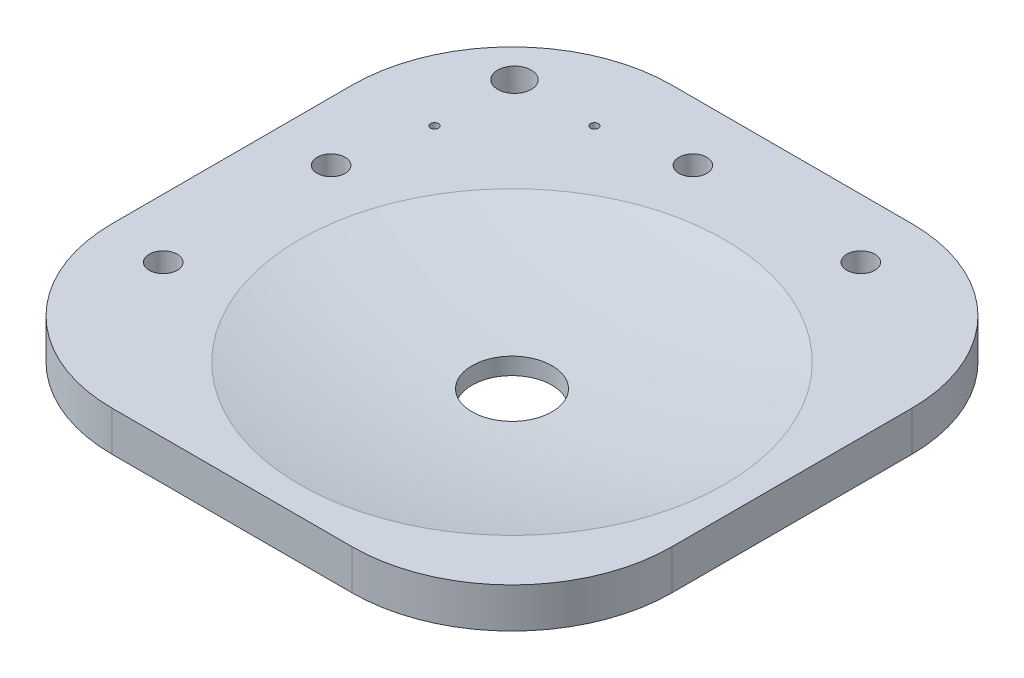
ISO-10303-21;
HEADER;
FILE_DESCRIPTION(('STEP AP214'),'2;1');
FILE_NAME('part.step','',(''),(''),'','','');
FILE_SCHEMA(('AUTOMOTIVE_DESIGN { 1 0 10303 214 1 1 1 1 }'));
ENDSEC;
DATA;
#1=APPLICATION_CONTEXT('core data for automotive mechanical design processes');
#2=APPLICATION_PROTOCOL_DEFINITION('international standard','automotive_design',2000,#1);
#3=PRODUCT_CONTEXT('',#1,'mechanical');
#4=PRODUCT('Part','Part','',(#3));
#5=PRODUCT_RELATED_PRODUCT_CATEGORY('part','',(#4));
#6=PRODUCT_DEFINITION_FORMATION('','',#4);
#7=PRODUCT_DEFINITION_CONTEXT('part definition',#1,'design');
#8=PRODUCT_DEFINITION('design','',#6,#7);
#9=PRODUCT_DEFINITION_SHAPE('','',#8);
#10=(LENGTH_UNIT() NAMED_UNIT(*) SI_UNIT(.MILLI.,.METRE.));
#11=(NAMED_UNIT(*) PLANE_ANGLE_UNIT() SI_UNIT($,.RADIAN.));
#12=(NAMED_UNIT(*) SI_UNIT($,.STERADIAN.) SOLID_ANGLE_UNIT());
#13=UNCERTAINTY_MEASURE_WITH_UNIT(LENGTH_MEASURE(1.E-05),#10,'distance_accuracy_value','');
#14=(GEOMETRIC_REPRESENTATION_CONTEXT(3) GLOBAL_UNCERTAINTY_ASSIGNED_CONTEXT((#13)) GLOBAL_UNIT_ASSIGNED_CONTEXT((#10,
#11,#12)) REPRESENTATION_CONTEXT('',''));
#15=CARTESIAN_POINT('',(0.,0.,0.));
#16=DIRECTION('',(0.,0.,1.));
#17=DIRECTION('',(1.,0.,0.));
#18=AXIS2_PLACEMENT_3D('',#15,#16,#17);
#19=CARTESIAN_POINT('',(30.,5.,30.));
#20=DIRECTION('',(-1.,0.,0.));
#21=DIRECTION('',(0.,0.,1.));
#22=AXIS2_PLACEMENT_3D('',#19,#20,#21);
#23=PLANE('',#22);
#24=DIRECTION('',(0.,0.,-1.));
#25=VECTOR('',#24,1.);
#26=CARTESIAN_POINT('',(30.,0.,30.));
#27=LINE('',#26,#25);
#28=CARTESIAN_POINT('',(30.,0.,10.));
#29=VERTEX_POINT('',#28);
#30=CARTESIAN_POINT('',(30.,0.,-20.));
#31=VERTEX_POINT('',#30);
#32=EDGE_CURVE('E147',#29,#31,#27,.T.);
#33=ORIENTED_EDGE('',*,*,#32,.T.);
#34=DIRECTION('',(0.,-1.,0.));
#35=VECTOR('',#34,1.);
#36=CARTESIAN_POINT('',(30.,5.,-20.));
#37=LINE('',#36,#35);
#38=CARTESIAN_POINT('',(30.,5.,-20.));
#39=VERTEX_POINT('',#38);
#40=EDGE_CURVE('E106',#31,#39,#37,.F.);
#41=ORIENTED_EDGE('',*,*,#40,.T.);
#42=DIRECTION('',(0.,0.,-1.));
#43=VECTOR('',#42,1.);
#44=CARTESIAN_POINT('',(30.,5.,30.));
#45=LINE('',#44,#43);
#46=CARTESIAN_POINT('',(30.,5.,10.));
#47=VERTEX_POINT('',#46);
#48=EDGE_CURVE('E148',#47,#39,#45,.T.);
#49=ORIENTED_EDGE('',*,*,#48,.F.);
#50=DIRECTION('',(0.,-1.,0.));
#51=VECTOR('',#50,1.);
#52=CARTESIAN_POINT('',(30.,5.,10.));
#53=LINE('',#52,#51);
#54=EDGE_CURVE('E111',#47,#29,#53,.T.);
#55=ORIENTED_EDGE('',*,*,#54,.T.);
#56=EDGE_LOOP('',(#33,#41,#49,#55));
#57=FACE_BOUND('',#56,.T.);
#58=ADVANCED_FACE('F33',(#57),#23,.F.);
#59=CARTESIAN_POINT('',(-30.,5.,30.));
#60=DIRECTION('',(0.,0.,-1.));
#61=DIRECTION('',(-1.,0.,0.));
#62=AXIS2_PLACEMENT_3D('',#59,#60,#61);
#63=PLANE('',#62);
#64=DIRECTION('',(1.,0.,0.));
#65=VECTOR('',#64,1.);
#66=CARTESIAN_POINT('',(-30.,5.,30.));
#67=LINE('',#66,#65);
#68=CARTESIAN_POINT('',(-20.,5.,30.));
#69=VERTEX_POINT('',#68);
#70=CARTESIAN_POINT('',(10.,5.,30.));
#71=VERTEX_POINT('',#70);
#72=EDGE_CURVE('E151',#69,#71,#67,.T.);
#73=ORIENTED_EDGE('',*,*,#72,.F.);
#74=DIRECTION('',(0.,-1.,0.));
#75=VECTOR('',#74,1.);
#76=CARTESIAN_POINT('',(-20.,5.,30.));
#77=LINE('',#76,#75);
#78=CARTESIAN_POINT('',(-20.,0.,30.));
#79=VERTEX_POINT('',#78);
#80=EDGE_CURVE('E11',#69,#79,#77,.T.);
#81=ORIENTED_EDGE('',*,*,#80,.T.);
#82=DIRECTION('',(1.,0.,0.));
#83=VECTOR('',#82,1.);
#84=CARTESIAN_POINT('',(-30.,0.,30.));
#85=LINE('',#84,#83);
#86=CARTESIAN_POINT('',(10.,0.,30.));
#87=VERTEX_POINT('',#86);
#88=EDGE_CURVE('E152',#79,#87,#85,.T.);
#89=ORIENTED_EDGE('',*,*,#88,.T.);
#90=DIRECTION('',(0.,-1.,0.));
#91=VECTOR('',#90,1.);
#92=CARTESIAN_POINT('',(10.,5.,30.));
#93=LINE('',#92,#91);
#94=EDGE_CURVE('E42',#87,#71,#93,.F.);
#95=ORIENTED_EDGE('',*,*,#94,.T.);
#96=EDGE_LOOP('',(#73,#81,#89,#95));
#97=FACE_BOUND('',#96,.T.);
#98=ADVANCED_FACE('F213',(#97),#63,.F.);
#99=CARTESIAN_POINT('',(0.,5.,0.));
#100=DIRECTION('',(0.,-1.,0.));
#101=DIRECTION('',(0.,0.,-1.));
#102=AXIS2_PLACEMENT_3D('',#99,#100,#101);
#103=PLANE('',#102);
#104=CARTESIAN_POINT('',(-30.4282430407,5.,-20.7373748181108));
#105=DIRECTION('',(0.,1.,0.));
#106=DIRECTION('',(0.,0.,1.));
#107=AXIS2_PLACEMENT_3D('',#104,#105,#106);
#108=CIRCLE('',#107,0.499999999999999);
#109=CARTESIAN_POINT('',(-30.4282430407,5.,-20.2373748181108));
#110=VERTEX_POINT('',#109);
#111=EDGE_CURVE('E319',#110,#110,#108,.T.);
#112=ORIENTED_EDGE('',*,*,#111,.F.);
#113=EDGE_LOOP('',(#112));
#114=FACE_BOUND('',#113,.T.);
#115=CARTESIAN_POINT('',(-20.4282430407,5.,-30.7373748181108));
#116=DIRECTION('',(0.,1.,0.));
#117=DIRECTION('',(0.,0.,1.));
#118=AXIS2_PLACEMENT_3D('',#115,#116,#117);
#119=CIRCLE('',#118,0.499999999999999);
#120=CARTESIAN_POINT('',(-20.4282430407,5.,-30.2373748181108));
#121=VERTEX_POINT('',#120);
#122=EDGE_CURVE('E318',#121,#121,#119,.T.);
#123=ORIENTED_EDGE('',*,*,#122,.F.);
#124=EDGE_LOOP('',(#123));
#125=FACE_BOUND('',#124,.T.);
#126=CARTESIAN_POINT('',(-30.4282430407,5.,-30.7373748181108));
#127=DIRECTION('',(0.,1.,0.));
#128=DIRECTION('',(0.,0.,1.));
#129=AXIS2_PLACEMENT_3D('',#126,#127,#128);
#130=CIRCLE('',#129,2.1);
#131=CARTESIAN_POINT('',(-30.4282430407,5.,-28.6373748181108));
#132=VERTEX_POINT('',#131);
#133=EDGE_CURVE('E182',#132,#132,#130,.T.);
#134=ORIENTED_EDGE('',*,*,#133,.F.);
#135=EDGE_LOOP('',(#134));
#136=FACE_BOUND('',#135,.T.);
#137=CARTESIAN_POINT('',(-32.6274169979694,5.,11.));
#138=DIRECTION('',(0.,1.,0.));
#139=DIRECTION('',(0.,0.,1.));
#140=AXIS2_PLACEMENT_3D('',#137,#138,#139);
#141=CIRCLE('',#140,1.75000000000008);
#142=CARTESIAN_POINT('',(-32.6274169979694,5.,12.7500000000001));
#143=VERTEX_POINT('',#142);
#144=EDGE_CURVE('E187',#143,#143,#141,.T.);
#145=ORIENTED_EDGE('',*,*,#144,.F.);
#146=EDGE_LOOP('',(#145));
#147=FACE_BOUND('',#146,.T.);
#148=CARTESIAN_POINT('',(11.,5.,-32.6274169979696));
#149=DIRECTION('',(0.,1.,0.));
#150=DIRECTION('',(0.,0.,1.));
#151=AXIS2_PLACEMENT_3D('',#148,#149,#150);
#152=CIRCLE('',#151,1.75000000000003);
#153=CARTESIAN_POINT('',(11.,5.,-30.8774169979696));
#154=VERTEX_POINT('',#153);
#155=EDGE_CURVE('E196',#154,#154,#152,.T.);
#156=ORIENTED_EDGE('',*,*,#155,.F.);
#157=EDGE_LOOP('',(#156));
#158=FACE_BOUND('',#157,.T.);
#159=CARTESIAN_POINT('',(-10.,5.,-32.6274169979696));
#160=DIRECTION('',(0.,1.,0.));
#161=DIRECTION('',(0.,0.,1.));
#162=AXIS2_PLACEMENT_3D('',#159,#160,#161);
#163=CIRCLE('',#162,1.75);
#164=CARTESIAN_POINT('',(-10.,5.,-30.8774169979696));
#165=VERTEX_POINT('',#164);
#166=EDGE_CURVE('E303',#165,#165,#163,.T.);
#167=ORIENTED_EDGE('',*,*,#166,.F.);
#168=EDGE_LOOP('',(#167));
#169=FACE_BOUND('',#168,.T.);
#170=CARTESIAN_POINT('',(-32.6274169979694,5.,-9.99999999999999));
#171=DIRECTION('',(0.,1.,0.));
#172=DIRECTION('',(0.,0.,1.));
#173=AXIS2_PLACEMENT_3D('',#170,#171,#172);
#174=CIRCLE('',#173,1.75);
#175=CARTESIAN_POINT('',(-32.6274169979694,5.,-8.24999999999999));
#176=VERTEX_POINT('',#175);
#177=EDGE_CURVE('E134',#176,#176,#174,.T.);
#178=ORIENTED_EDGE('',*,*,#177,.F.);
#179=EDGE_LOOP('',(#178));
#180=FACE_BOUND('',#179,.T.);
#181=ORIENTED_EDGE('',*,*,#48,.T.);
#182=CARTESIAN_POINT('',(10.,5.,-20.));
#183=DIRECTION('',(0.,-1.,0.));
#184=DIRECTION('',(0.,0.,-1.));
#185=AXIS2_PLACEMENT_3D('',#182,#183,#184);
#186=CIRCLE('',#185,20.);
#187=CARTESIAN_POINT('',(10.,5.,-40.));
#188=VERTEX_POINT('',#187);
#189=EDGE_CURVE('E171',#39,#188,#186,.F.);
#190=ORIENTED_EDGE('',*,*,#189,.T.);
#191=DIRECTION('',(-1.,0.,0.));
#192=VECTOR('',#191,1.);
#193=CARTESIAN_POINT('',(-40.,5.,-40.));
#194=LINE('',#193,#192);
#195=CARTESIAN_POINT('',(-20.,5.,-40.));
#196=VERTEX_POINT('',#195);
#197=EDGE_CURVE('E121',#188,#196,#194,.T.);
#198=ORIENTED_EDGE('',*,*,#197,.T.);
#199=CARTESIAN_POINT('',(-20.,5.,-20.));
#200=DIRECTION('',(0.,-1.,0.));
#201=DIRECTION('',(0.,0.,-1.));
#202=AXIS2_PLACEMENT_3D('',#199,#200,#201);
#203=CIRCLE('',#202,20.);
#204=CARTESIAN_POINT('',(-40.,5.,-20.));
#205=VERTEX_POINT('',#204);
#206=EDGE_CURVE('E169',#196,#205,#203,.F.);
#207=ORIENTED_EDGE('',*,*,#206,.T.);
#208=DIRECTION('',(0.,0.,1.));
#209=VECTOR('',#208,1.);
#210=CARTESIAN_POINT('',(-40.,5.,30.));
#211=LINE('',#210,#209);
#212=CARTESIAN_POINT('',(-40.,5.,10.));
#213=VERTEX_POINT('',#212);
#214=EDGE_CURVE('E137',#205,#213,#211,.T.);
#215=ORIENTED_EDGE('',*,*,#214,.T.);
#216=CARTESIAN_POINT('',(-20.,5.,10.));
#217=DIRECTION('',(0.,-1.,0.));
#218=DIRECTION('',(0.,0.,-1.));
#219=AXIS2_PLACEMENT_3D('',#216,#217,#218);
#220=CIRCLE('',#219,20.);
#221=EDGE_CURVE('E56',#213,#69,#220,.F.);
#222=ORIENTED_EDGE('',*,*,#221,.T.);
#223=ORIENTED_EDGE('',*,*,#72,.T.);
#224=CARTESIAN_POINT('',(10.,5.,10.));
#225=DIRECTION('',(0.,-1.,0.));
#226=DIRECTION('',(0.,0.,-1.));
#227=AXIS2_PLACEMENT_3D('',#224,#225,#226);
#228=CIRCLE('',#227,20.);
#229=EDGE_CURVE('E166',#71,#47,#228,.F.);
#230=ORIENTED_EDGE('',*,*,#229,.T.);
#231=EDGE_LOOP('',(#181,#190,#198,#207,#215,#222,#223,#230));
#232=FACE_BOUND('',#231,.T.);
#233=CARTESIAN_POINT('',(0.,5.,0.));
#234=DIRECTION('',(0.,-1.,0.));
#235=DIRECTION('',(0.,0.,-1.));
#236=AXIS2_PLACEMENT_3D('',#233,#234,#235);
#237=CIRCLE('',#236,26.558371778702);
#238=CARTESIAN_POINT('',(-26.558371778702,5.00000000000002,0.));
#239=VERTEX_POINT('',#238);
#240=EDGE_CURVE('E140',#239,#239,#237,.T.);
#241=ORIENTED_EDGE('',*,*,#240,.T.);
#242=EDGE_LOOP('',(#241));
#243=FACE_BOUND('',#242,.T.);
#244=ADVANCED_FACE('F204',(#114,#125,#136,#147,#158,#169,#180,#232,#243),#103,.F.);
#245=CARTESIAN_POINT('',(0.,0.,0.));
#246=DIRECTION('',(0.,-1.,0.));
#247=DIRECTION('',(0.,0.,-1.));
#248=AXIS2_PLACEMENT_3D('',#245,#246,#247);
#249=PLANE('',#248);
#250=CARTESIAN_POINT('',(-30.4282430407,0.,-20.7373748181108));
#251=DIRECTION('',(0.,-1.,0.));
#252=DIRECTION('',(0.,0.,-1.));
#253=AXIS2_PLACEMENT_3D('',#250,#251,#252);
#254=CIRCLE('',#253,0.499999999999999);
#255=CARTESIAN_POINT('',(-30.4282430407,0.,-21.2373748181108));
#256=VERTEX_POINT('',#255);
#257=EDGE_CURVE('E37',#256,#256,#254,.T.);
#258=ORIENTED_EDGE('',*,*,#257,.F.);
#259=EDGE_LOOP('',(#258));
#260=FACE_BOUND('',#259,.T.);
#261=CARTESIAN_POINT('',(-20.4282430407,0.,-30.7373748181108));
#262=DIRECTION('',(0.,-1.,0.));
#263=DIRECTION('',(0.,0.,-1.));
#264=AXIS2_PLACEMENT_3D('',#261,#262,#263);
#265=CIRCLE('',#264,0.499999999999999);
#266=CARTESIAN_POINT('',(-20.4282430407,0.,-31.2373748181108));
#267=VERTEX_POINT('',#266);
#268=EDGE_CURVE('E181',#267,#267,#265,.T.);
#269=ORIENTED_EDGE('',*,*,#268,.F.);
#270=EDGE_LOOP('',(#269));
#271=FACE_BOUND('',#270,.T.);
#272=CARTESIAN_POINT('',(-30.4282430407,0.,-30.7373748181108));
#273=DIRECTION('',(0.,-1.,0.));
#274=DIRECTION('',(0.,0.,-1.));
#275=AXIS2_PLACEMENT_3D('',#272,#273,#274);
#276=CIRCLE('',#275,2.1);
#277=CARTESIAN_POINT('',(-30.4282430407,0.,-32.8373748181108));
#278=VERTEX_POINT('',#277);
#279=EDGE_CURVE('E179',#278,#278,#276,.T.);
#280=ORIENTED_EDGE('',*,*,#279,.F.);
#281=EDGE_LOOP('',(#280));
#282=FACE_BOUND('',#281,.T.);
#283=CARTESIAN_POINT('',(-32.6274169979694,0.,11.));
#284=DIRECTION('',(0.,1.,0.));
#285=DIRECTION('',(0.,0.,1.));
#286=AXIS2_PLACEMENT_3D('',#283,#284,#285);
#287=CIRCLE('',#286,1.75000000000008);
#288=CARTESIAN_POINT('',(-32.6274169979694,0.,12.7500000000001));
#289=VERTEX_POINT('',#288);
#290=EDGE_CURVE('E191',#289,#289,#287,.T.);
#291=ORIENTED_EDGE('',*,*,#290,.T.);
#292=EDGE_LOOP('',(#291));
#293=FACE_BOUND('',#292,.T.);
#294=CARTESIAN_POINT('',(11.,0.,-32.6274169979696));
#295=DIRECTION('',(0.,1.,0.));
#296=DIRECTION('',(0.,0.,1.));
#297=AXIS2_PLACEMENT_3D('',#294,#295,#296);
#298=CIRCLE('',#297,1.75000000000003);
#299=CARTESIAN_POINT('',(11.,0.,-30.8774169979696));
#300=VERTEX_POINT('',#299);
#301=EDGE_CURVE('E295',#300,#300,#298,.T.);
#302=ORIENTED_EDGE('',*,*,#301,.T.);
#303=EDGE_LOOP('',(#302));
#304=FACE_BOUND('',#303,.T.);
#305=CARTESIAN_POINT('',(-10.,0.,-32.6274169979696));
#306=DIRECTION('',(0.,1.,0.));
#307=DIRECTION('',(0.,0.,1.));
#308=AXIS2_PLACEMENT_3D('',#305,#306,#307);
#309=CIRCLE('',#308,1.75);
#310=CARTESIAN_POINT('',(-10.,0.,-30.8774169979696));
#311=VERTEX_POINT('',#310);
#312=EDGE_CURVE('E201',#311,#311,#309,.T.);
#313=ORIENTED_EDGE('',*,*,#312,.T.);
#314=EDGE_LOOP('',(#313));
#315=FACE_BOUND('',#314,.T.);
#316=CARTESIAN_POINT('',(-32.6274169979694,0.,-9.99999999999999));
#317=DIRECTION('',(0.,1.,0.));
#318=DIRECTION('',(0.,0.,1.));
#319=AXIS2_PLACEMENT_3D('',#316,#317,#318);
#320=CIRCLE('',#319,1.75);
#321=CARTESIAN_POINT('',(-32.6274169979694,0.,-8.24999999999999));
#322=VERTEX_POINT('',#321);
#323=EDGE_CURVE('E129',#322,#322,#320,.T.);
#324=ORIENTED_EDGE('',*,*,#323,.T.);
#325=EDGE_LOOP('',(#324));
#326=FACE_BOUND('',#325,.T.);
#327=DIRECTION('',(-1.,0.,0.));
#328=VECTOR('',#327,1.);
#329=CARTESIAN_POINT('',(-40.,0.,-40.));
#330=LINE('',#329,#328);
#331=CARTESIAN_POINT('',(10.,0.,-40.));
#332=VERTEX_POINT('',#331);
#333=CARTESIAN_POINT('',(-20.,0.,-40.));
#334=VERTEX_POINT('',#333);
#335=EDGE_CURVE('E118',#332,#334,#330,.T.);
#336=ORIENTED_EDGE('',*,*,#335,.F.);
#337=CARTESIAN_POINT('',(10.,0.,-20.));
#338=DIRECTION('',(0.,-1.,0.));
#339=DIRECTION('',(0.,0.,-1.));
#340=AXIS2_PLACEMENT_3D('',#337,#338,#339);
#341=CIRCLE('',#340,20.);
#342=EDGE_CURVE('E101',#332,#31,#341,.T.);
#343=ORIENTED_EDGE('',*,*,#342,.T.);
#344=ORIENTED_EDGE('',*,*,#32,.F.);
#345=CARTESIAN_POINT('',(10.,0.,10.));
#346=DIRECTION('',(0.,-1.,0.));
#347=DIRECTION('',(0.,0.,-1.));
#348=AXIS2_PLACEMENT_3D('',#345,#346,#347);
#349=CIRCLE('',#348,20.);
#350=EDGE_CURVE('E122',#29,#87,#349,.T.);
#351=ORIENTED_EDGE('',*,*,#350,.T.);
#352=ORIENTED_EDGE('',*,*,#88,.F.);
#353=CARTESIAN_POINT('',(-20.,0.,10.));
#354=DIRECTION('',(0.,-1.,0.));
#355=DIRECTION('',(0.,0.,-1.));
#356=AXIS2_PLACEMENT_3D('',#353,#354,#355);
#357=CIRCLE('',#356,20.);
#358=CARTESIAN_POINT('',(-40.,0.,10.));
#359=VERTEX_POINT('',#358);
#360=EDGE_CURVE('E160',#79,#359,#357,.T.);
#361=ORIENTED_EDGE('',*,*,#360,.T.);
#362=DIRECTION('',(0.,0.,1.));
#363=VECTOR('',#362,1.);
#364=CARTESIAN_POINT('',(-40.,0.,30.));
#365=LINE('',#364,#363);
#366=CARTESIAN_POINT('',(-40.,0.,-20.));
#367=VERTEX_POINT('',#366);
#368=EDGE_CURVE('E128',#367,#359,#365,.T.);
#369=ORIENTED_EDGE('',*,*,#368,.F.);
#370=CARTESIAN_POINT('',(-20.,0.,-20.));
#371=DIRECTION('',(0.,-1.,0.));
#372=DIRECTION('',(0.,0.,-1.));
#373=AXIS2_PLACEMENT_3D('',#370,#371,#372);
#374=CIRCLE('',#373,20.);
#375=EDGE_CURVE('E112',#367,#334,#374,.T.);
#376=ORIENTED_EDGE('',*,*,#375,.T.);
#377=EDGE_LOOP('',(#336,#343,#344,#351,#352,#361,#369,#376));
#378=FACE_BOUND('',#377,.T.);
#379=CARTESIAN_POINT('',(0.,0.,0.));
#380=DIRECTION('',(0.,1.,0.));
#381=DIRECTION('',(0.,0.,1.));
#382=AXIS2_PLACEMENT_3D('',#379,#380,#381);
#383=CIRCLE('',#382,5.);
#384=CARTESIAN_POINT('',(0.,0.,5.));
#385=VERTEX_POINT('',#384);
#386=EDGE_CURVE('E143',#385,#385,#383,.T.);
#387=ORIENTED_EDGE('',*,*,#386,.T.);
#388=EDGE_LOOP('',(#387));
#389=FACE_BOUND('',#388,.T.);
#390=ADVANCED_FACE('F125',(#260,#271,#282,#293,#304,#315,#326,#378,#389),#249,.T.);
#391=CARTESIAN_POINT('',(0.,0.,0.));
#392=DIRECTION('',(0.,1.,0.));
#393=DIRECTION('',(0.,0.,1.));
#394=AXIS2_PLACEMENT_3D('',#391,#392,#393);
#395=CYLINDRICAL_SURFACE('',#394,5.);
#396=CARTESIAN_POINT('',(0.,2.11206466599696,0.));
#397=DIRECTION('',(0.,1.,0.));
#398=DIRECTION('',(0.,0.,1.));
#399=AXIS2_PLACEMENT_3D('',#396,#397,#398);
#400=CIRCLE('',#399,5.);
#401=CARTESIAN_POINT('',(-4.99999999999997,2.11206466599696,0.));
#402=VERTEX_POINT('',#401);
#403=EDGE_CURVE('E144',#402,#402,#400,.T.);
#404=ORIENTED_EDGE('',*,*,#403,.T.);
#405=EDGE_LOOP('',(#404));
#406=FACE_BOUND('',#405,.T.);
#407=ORIENTED_EDGE('',*,*,#386,.F.);
#408=EDGE_LOOP('',(#407));
#409=FACE_BOUND('',#408,.T.);
#410=ADVANCED_FACE('F275',(#406,#409),#395,.F.);
#411=CARTESIAN_POINT('',(0.,121.347297172836,0.));
#412=DIRECTION('',(0.,-1.,0.));
#413=DIRECTION('',(-1.,0.,0.));
#414=AXIS2_PLACEMENT_3D('',#411,#412,#413);
#415=SPHERICAL_SURFACE('',#414,119.34002124585);
#416=CARTESIAN_POINT('',(-4.99999999999997,2.11206466599696,0.));
#417=CARTESIAN_POINT('',(-5.22668789144035,2.12157056900335,0.));
#418=CARTESIAN_POINT('',(-5.45334867348346,2.1317229492846,0.));
#419=CARTESIAN_POINT('',(-5.90660864700018,2.15332030097376,0.));
#420=CARTESIAN_POINT('',(-6.13320783847378,2.16476527238166,0.));
#421=CARTESIAN_POINT('',(-6.58633725907645,2.18894744290104,0.));
#422=CARTESIAN_POINT('',(-6.81286748820552,2.20168464201253,0.));
#423=CARTESIAN_POINT('',(-7.26585161512438,2.22845085121252,0.));
#424=CARTESIAN_POINT('',(-7.49230551291415,2.24247986130102,0.));
#425=CARTESIAN_POINT('',(-7.94512961049887,2.27182923672442,0.));
#426=CARTESIAN_POINT('',(-8.17149981029379,2.28714960205931,0.));
#427=CARTESIAN_POINT('',(-8.62414914799454,2.31908118942761,0.));
#428=CARTESIAN_POINT('',(-8.85042828590036,2.33569241146103,0.));
#429=CARTESIAN_POINT('',(-9.30288813888057,2.37020517190329,0.));
#430=CARTESIAN_POINT('',(-9.52906885395496,2.38810671031214,0.));
#431=CARTESIAN_POINT('',(-9.98132450353446,2.42519952114964,0.));
#432=CARTESIAN_POINT('',(-10.2073994380396,2.4443907935783,0.));
#433=CARTESIAN_POINT('',(-10.6594361721831,2.48406244815983,0.));
#434=CARTESIAN_POINT('',(-10.8853979718214,2.50454283031271,0.));
#435=CARTESIAN_POINT('',(-11.3372010856144,2.54679203810775,0.));
#436=CARTESIAN_POINT('',(-11.5630423997691,2.56856086374992,0.));
#437=CARTESIAN_POINT('',(-12.014597195897,2.61338625037623,0.));
#438=CARTESIAN_POINT('',(-12.2403106778703,2.63644281136037,0.));
#439=CARTESIAN_POINT('',(-12.6916024670965,2.68384291863248,0.));
#440=CARTESIAN_POINT('',(-12.9171807743493,2.70818646492045,0.));
#441=CARTESIAN_POINT('',(-13.3681948759927,2.7581597508961,0.));
#442=CARTESIAN_POINT('',(-13.5936306703832,2.78378949058378,0.));
#443=CARTESIAN_POINT('',(-14.044352412796,2.83633432961438,0.));
#444=CARTESIAN_POINT('',(-14.2696383608182,2.8632494289573,0.));
#445=CARTESIAN_POINT('',(-14.7200530818632,2.9183641117407,0.));
#446=CARTESIAN_POINT('',(-14.945181854886,2.94656369518119,0.));
#447=CARTESIAN_POINT('',(-15.3952749024135,3.00424642881732,0.));
#448=CARTESIAN_POINT('',(-15.6202391769183,3.03372957901297,0.));
#449=CARTESIAN_POINT('',(-16.0699959092428,3.09397848706218,0.));
#450=CARTESIAN_POINT('',(-16.2947883670625,3.12474424491574,0.));
#451=CARTESIAN_POINT('',(-16.744194153439,3.18755736745982,0.));
#452=CARTESIAN_POINT('',(-16.9688074819957,3.21960473215033,0.));
#453=CARTESIAN_POINT('',(-17.4178477030953,3.28498002585622,0.));
#454=CARTESIAN_POINT('',(-17.6422745956383,3.31830795487159,0.));
#455=CARTESIAN_POINT('',(-18.0909346440244,3.38624329305795,0.));
#456=CARTESIAN_POINT('',(-18.3151677998677,3.42085070222894,0.));
#457=CARTESIAN_POINT('',(-18.7634330804707,3.49134387493527,0.));
#458=CARTESIAN_POINT('',(-18.9874652052306,3.52722963847062,0.));
#459=CARTESIAN_POINT('',(-19.4353211358229,3.60027835252914,0.));
#460=CARTESIAN_POINT('',(-19.6591449416555,3.63744130305231,0.));
#461=CARTESIAN_POINT('',(-20.1065769533258,3.71304318216266,0.));
#462=CARTESIAN_POINT('',(-20.3301851591636,3.75148211074983,0.));
#463=CARTESIAN_POINT('',(-20.7771786967908,3.82963469555603,0.));
#464=CARTESIAN_POINT('',(-21.0005640285802,3.86934835177506,0.));
#465=CARTESIAN_POINT('',(-21.4471045513067,3.95004909994661,0.));
#466=CARTESIAN_POINT('',(-21.6702597422438,3.99103619189912,0.));
#467=CARTESIAN_POINT('',(-22.1163327239496,4.07428247820987,0.));
#468=CARTESIAN_POINT('',(-22.3392505147182,4.1165416725681,0.));
#469=CARTESIAN_POINT('',(-22.7848414444899,4.2023307889958,0.));
#470=CARTESIAN_POINT('',(-23.0075145834929,4.24586071106526,0.));
#471=CARTESIAN_POINT('',(-23.4526089661077,4.33418986682692,0.));
#472=CARTESIAN_POINT('',(-23.6750302097194,4.37898910051912,0.));
#473=CARTESIAN_POINT('',(-24.1196135660729,4.46985542235845,0.));
#474=CARTESIAN_POINT('',(-24.3417756788147,4.51592251050558,0.));
#475=CARTESIAN_POINT('',(-24.785833546555,4.60932304205267,0.));
#476=CARTESIAN_POINT('',(-25.0077293015536,4.65665648545264,0.));
#477=CARTESIAN_POINT('',(-25.4512472349431,4.75258819005868,0.));
#478=CARTESIAN_POINT('',(-25.6728694133341,4.80118645126476,0.));
#479=CARTESIAN_POINT('',(-26.1158329859911,4.89964620188041,0.));
#480=CARTESIAN_POINT('',(-26.3371743802571,4.94950769128999,0.));
#481=CARTESIAN_POINT('',(-26.558371778702,5.00000000000002,0.));
#482=B_SPLINE_CURVE_WITH_KNOTS('',3,(#416,#417,#418,#419,#420,#421,#422,#423,#424,#425,#426,
#427,#428,#429,#430,#431,#432,#433,#434,#435,#436,#437,#438,#439,#440,#441,#442,#443,#444,#445,
#446,#447,#448,#449,#450,#451,#452,#453,#454,#455,#456,#457,#458,#459,#460,#461,#462,#463,#464,
#465,#466,#467,#468,#469,#470,#471,#472,#473,#474,#475,#476,#477,#478,#479,#480,#481),
.UNSPECIFIED.,.F.,.F.,(4,2,2,2,2,2,2,2,2,2,2,2,2,2,2,2,2,2,2,2,2,2,2,2,2,2,2,2,2,2,2,2,4),(0.,
0.680660418082232,1.36132083616449,2.04198125424672,2.72264167232898,3.40330209041121,
4.08396250849344,4.7646229265757,5.44528334465793,6.12594376274016,6.80660418082242,
7.48726459890465,8.16792501698688,8.84858543506914,9.52924585315137,10.2099062712336,
10.8905666893159,11.5712271073981,12.2518875254803,12.9325479435626,13.6132083616448,
14.2938687797271,14.9745291978093,15.6551896158916,16.3358500339738,17.016510452056,
17.6971708701383,18.3778312882205,19.0584917063027,19.739152124385,20.4198125424672,
21.1004729605495,21.7811333786317),.UNSPECIFIED.);
#483=EDGE_CURVE('BSEAM272',#402,#239,#482,.T.);
#484=ORIENTED_EDGE('',*,*,#403,.F.);
#485=ORIENTED_EDGE('',*,*,#240,.F.);
#486=ORIENTED_EDGE('',*,*,#483,.T.);
#487=ORIENTED_EDGE('',*,*,#483,.F.);
#488=EDGE_LOOP('',(#484,#486,#485,#487));
#489=FACE_BOUND('',#488,.T.);
#490=ADVANCED_FACE('F272',(#489),#415,.F.);
#491=CARTESIAN_POINT('',(-40.,5.,-40.));
#492=DIRECTION('',(0.,0.,1.));
#493=DIRECTION('',(1.,0.,0.));
#494=AXIS2_PLACEMENT_3D('',#491,#492,#493);
#495=PLANE('',#494);
#496=ORIENTED_EDGE('',*,*,#197,.F.);
#497=DIRECTION('',(0.,-1.,0.));
#498=VECTOR('',#497,1.);
#499=CARTESIAN_POINT('',(10.,5.,-40.));
#500=LINE('',#499,#498);
#501=EDGE_CURVE('E105',#188,#332,#500,.T.);
#502=ORIENTED_EDGE('',*,*,#501,.T.);
#503=ORIENTED_EDGE('',*,*,#335,.T.);
#504=DIRECTION('',(0.,-1.,0.));
#505=VECTOR('',#504,1.);
#506=CARTESIAN_POINT('',(-20.,5.,-40.));
#507=LINE('',#506,#505);
#508=EDGE_CURVE('E123',#334,#196,#507,.F.);
#509=ORIENTED_EDGE('',*,*,#508,.T.);
#510=EDGE_LOOP('',(#496,#502,#503,#509));
#511=FACE_BOUND('',#510,.T.);
#512=ADVANCED_FACE('F117',(#511),#495,.F.);
#513=CARTESIAN_POINT('',(-40.,5.,30.));
#514=DIRECTION('',(1.,0.,0.));
#515=DIRECTION('',(0.,0.,-1.));
#516=AXIS2_PLACEMENT_3D('',#513,#514,#515);
#517=PLANE('',#516);
#518=ORIENTED_EDGE('',*,*,#214,.F.);
#519=DIRECTION('',(0.,-1.,0.));
#520=VECTOR('',#519,1.);
#521=CARTESIAN_POINT('',(-40.,5.,-20.));
#522=LINE('',#521,#520);
#523=EDGE_CURVE('E175',#205,#367,#522,.T.);
#524=ORIENTED_EDGE('',*,*,#523,.T.);
#525=ORIENTED_EDGE('',*,*,#368,.T.);
#526=DIRECTION('',(0.,-1.,0.));
#527=VECTOR('',#526,1.);
#528=CARTESIAN_POINT('',(-40.,5.,10.));
#529=LINE('',#528,#527);
#530=EDGE_CURVE('E173',#359,#213,#529,.F.);
#531=ORIENTED_EDGE('',*,*,#530,.T.);
#532=EDGE_LOOP('',(#518,#524,#525,#531));
#533=FACE_BOUND('',#532,.T.);
#534=ADVANCED_FACE('F266',(#533),#517,.F.);
#535=CARTESIAN_POINT('',(-32.6274169979694,0.,-9.99999999999999));
#536=DIRECTION('',(0.,1.,0.));
#537=DIRECTION('',(0.,0.,1.));
#538=AXIS2_PLACEMENT_3D('',#535,#536,#537);
#539=CYLINDRICAL_SURFACE('',#538,1.75);
#540=ORIENTED_EDGE('',*,*,#323,.F.);
#541=EDGE_LOOP('',(#540));
#542=FACE_BOUND('',#541,.T.);
#543=ORIENTED_EDGE('',*,*,#177,.T.);
#544=EDGE_LOOP('',(#543));
#545=FACE_BOUND('',#544,.T.);
#546=ADVANCED_FACE('F256',(#542,#545),#539,.F.);
#547=CARTESIAN_POINT('',(-10.,0.,-32.6274169979696));
#548=DIRECTION('',(0.,1.,0.));
#549=DIRECTION('',(0.,0.,1.));
#550=AXIS2_PLACEMENT_3D('',#547,#548,#549);
#551=CYLINDRICAL_SURFACE('',#550,1.75);
#552=ORIENTED_EDGE('',*,*,#312,.F.);
#553=EDGE_LOOP('',(#552));
#554=FACE_BOUND('',#553,.T.);
#555=ORIENTED_EDGE('',*,*,#166,.T.);
#556=EDGE_LOOP('',(#555));
#557=FACE_BOUND('',#556,.T.);
#558=ADVANCED_FACE('F252',(#554,#557),#551,.F.);
#559=CARTESIAN_POINT('',(11.,0.,-32.6274169979696));
#560=DIRECTION('',(0.,1.,0.));
#561=DIRECTION('',(0.,0.,1.));
#562=AXIS2_PLACEMENT_3D('',#559,#560,#561);
#563=CYLINDRICAL_SURFACE('',#562,1.75000000000003);
#564=ORIENTED_EDGE('',*,*,#301,.F.);
#565=EDGE_LOOP('',(#564));
#566=FACE_BOUND('',#565,.T.);
#567=ORIENTED_EDGE('',*,*,#155,.T.);
#568=EDGE_LOOP('',(#567));
#569=FACE_BOUND('',#568,.T.);
#570=ADVANCED_FACE('F255',(#566,#569),#563,.F.);
#571=CARTESIAN_POINT('',(-32.6274169979694,0.,11.));
#572=DIRECTION('',(0.,1.,0.));
#573=DIRECTION('',(0.,0.,1.));
#574=AXIS2_PLACEMENT_3D('',#571,#572,#573);
#575=CYLINDRICAL_SURFACE('',#574,1.75000000000008);
#576=ORIENTED_EDGE('',*,*,#290,.F.);
#577=EDGE_LOOP('',(#576));
#578=FACE_BOUND('',#577,.T.);
#579=ORIENTED_EDGE('',*,*,#144,.T.);
#580=EDGE_LOOP('',(#579));
#581=FACE_BOUND('',#580,.T.);
#582=ADVANCED_FACE('F230',(#578,#581),#575,.F.);
#583=CARTESIAN_POINT('',(10.,5.,-20.));
#584=DIRECTION('',(0.,-1.,0.));
#585=DIRECTION('',(0.,0.,-1.));
#586=AXIS2_PLACEMENT_3D('',#583,#584,#585);
#587=CYLINDRICAL_SURFACE('',#586,20.);
#588=ORIENTED_EDGE('',*,*,#189,.F.);
#589=ORIENTED_EDGE('',*,*,#40,.F.);
#590=ORIENTED_EDGE('',*,*,#342,.F.);
#591=ORIENTED_EDGE('',*,*,#501,.F.);
#592=EDGE_LOOP('',(#588,#589,#590,#591));
#593=FACE_BOUND('',#592,.T.);
#594=ADVANCED_FACE('F104',(#593),#587,.T.);
#595=CARTESIAN_POINT('',(-20.,5.,-20.));
#596=DIRECTION('',(0.,-1.,0.));
#597=DIRECTION('',(0.,0.,-1.));
#598=AXIS2_PLACEMENT_3D('',#595,#596,#597);
#599=CYLINDRICAL_SURFACE('',#598,20.);
#600=ORIENTED_EDGE('',*,*,#206,.F.);
#601=ORIENTED_EDGE('',*,*,#508,.F.);
#602=ORIENTED_EDGE('',*,*,#375,.F.);
#603=ORIENTED_EDGE('',*,*,#523,.F.);
#604=EDGE_LOOP('',(#600,#601,#602,#603));
#605=FACE_BOUND('',#604,.T.);
#606=ADVANCED_FACE('F229',(#605),#599,.T.);
#607=CARTESIAN_POINT('',(-20.,5.,10.));
#608=DIRECTION('',(0.,-1.,0.));
#609=DIRECTION('',(0.,0.,-1.));
#610=AXIS2_PLACEMENT_3D('',#607,#608,#609);
#611=CYLINDRICAL_SURFACE('',#610,20.);
#612=ORIENTED_EDGE('',*,*,#221,.F.);
#613=ORIENTED_EDGE('',*,*,#530,.F.);
#614=ORIENTED_EDGE('',*,*,#360,.F.);
#615=ORIENTED_EDGE('',*,*,#80,.F.);
#616=EDGE_LOOP('',(#612,#613,#614,#615));
#617=FACE_BOUND('',#616,.T.);
#618=ADVANCED_FACE('F211',(#617),#611,.T.);
#619=CARTESIAN_POINT('',(10.,5.,10.));
#620=DIRECTION('',(0.,-1.,0.));
#621=DIRECTION('',(0.,0.,-1.));
#622=AXIS2_PLACEMENT_3D('',#619,#620,#621);
#623=CYLINDRICAL_SURFACE('',#622,20.);
#624=ORIENTED_EDGE('',*,*,#229,.F.);
#625=ORIENTED_EDGE('',*,*,#94,.F.);
#626=ORIENTED_EDGE('',*,*,#350,.F.);
#627=ORIENTED_EDGE('',*,*,#54,.F.);
#628=EDGE_LOOP('',(#624,#625,#626,#627));
#629=FACE_BOUND('',#628,.T.);
#630=ADVANCED_FACE('F35',(#629),#623,.T.);
#631=CARTESIAN_POINT('',(-30.4282430407,-5.,-30.7373748181108));
#632=DIRECTION('',(0.,1.,0.));
#633=DIRECTION('',(0.,0.,1.));
#634=AXIS2_PLACEMENT_3D('',#631,#632,#633);
#635=CYLINDRICAL_SURFACE('',#634,2.1);
#636=ORIENTED_EDGE('',*,*,#279,.T.);
#637=EDGE_LOOP('',(#636));
#638=FACE_BOUND('',#637,.T.);
#639=ORIENTED_EDGE('',*,*,#133,.T.);
#640=EDGE_LOOP('',(#639));
#641=FACE_BOUND('',#640,.T.);
#642=ADVANCED_FACE('F237',(#638,#641),#635,.F.);
#643=CARTESIAN_POINT('',(-20.4282430407,-5.,-30.7373748181108));
#644=DIRECTION('',(0.,1.,0.));
#645=DIRECTION('',(0.,0.,1.));
#646=AXIS2_PLACEMENT_3D('',#643,#644,#645);
#647=CYLINDRICAL_SURFACE('',#646,0.499999999999999);
#648=ORIENTED_EDGE('',*,*,#268,.T.);
#649=EDGE_LOOP('',(#648));
#650=FACE_BOUND('',#649,.T.);
#651=ORIENTED_EDGE('',*,*,#122,.T.);
#652=EDGE_LOOP('',(#651));
#653=FACE_BOUND('',#652,.T.);
#654=ADVANCED_FACE('F241',(#650,#653),#647,.F.);
#655=CARTESIAN_POINT('',(-30.4282430407,-5.,-20.7373748181108));
#656=DIRECTION('',(0.,1.,0.));
#657=DIRECTION('',(0.,0.,1.));
#658=AXIS2_PLACEMENT_3D('',#655,#656,#657);
#659=CYLINDRICAL_SURFACE('',#658,0.499999999999999);
#660=ORIENTED_EDGE('',*,*,#257,.T.);
#661=EDGE_LOOP('',(#660));
#662=FACE_BOUND('',#661,.T.);
#663=ORIENTED_EDGE('',*,*,#111,.T.);
#664=EDGE_LOOP('',(#663));
#665=FACE_BOUND('',#664,.T.);
#666=ADVANCED_FACE('F247',(#662,#665),#659,.F.);
#667=CLOSED_SHELL('',(#58,#98,#244,#390,#410,#490,#512,#534,#546,#558,#570,#582,#594,#606,#618,
#630,#642,#654,#666));
#668=MANIFOLD_SOLID_BREP('B2',#667);
#669=ADVANCED_BREP_SHAPE_REPRESENTATION('',(#18,#668),#14);
#670=SHAPE_DEFINITION_REPRESENTATION(#9,#669);
ENDSEC;
END-ISO-10303-21;
